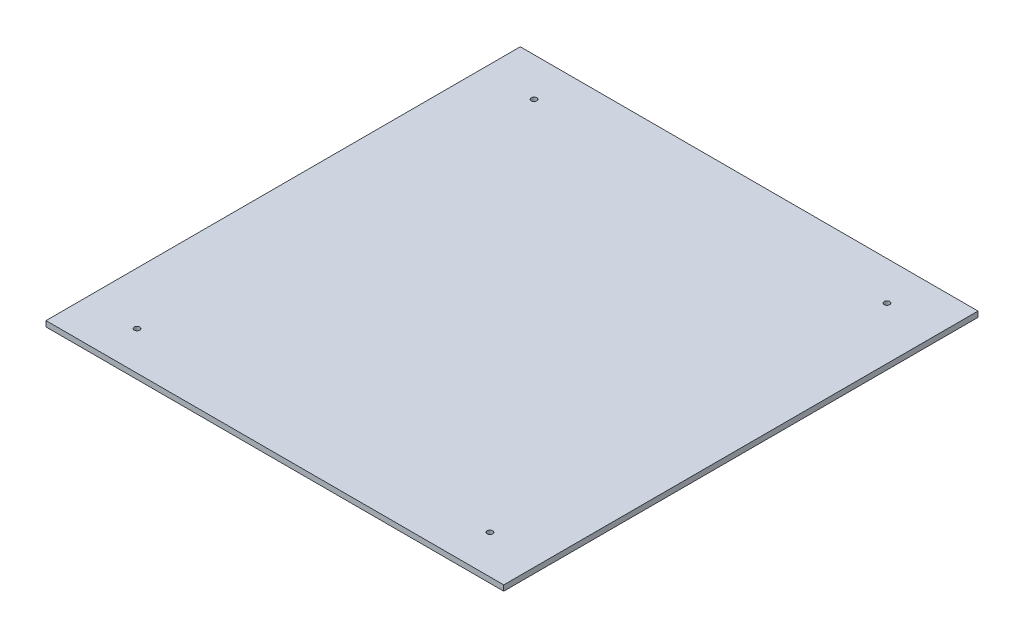
ISO-10303-21;
HEADER;
FILE_DESCRIPTION(('STEP AP214'),'2;1');
FILE_NAME('part.step','',(''),(''),'','','');
FILE_SCHEMA(('AUTOMOTIVE_DESIGN { 1 0 10303 214 1 1 1 1 }'));
ENDSEC;
DATA;
#1=APPLICATION_CONTEXT('core data for automotive mechanical design processes');
#2=APPLICATION_PROTOCOL_DEFINITION('international standard','automotive_design',2000,#1);
#3=PRODUCT_CONTEXT('',#1,'mechanical');
#4=PRODUCT('Part','Part','',(#3));
#5=PRODUCT_RELATED_PRODUCT_CATEGORY('part','',(#4));
#6=PRODUCT_DEFINITION_FORMATION('','',#4);
#7=PRODUCT_DEFINITION_CONTEXT('part definition',#1,'design');
#8=PRODUCT_DEFINITION('design','',#6,#7);
#9=PRODUCT_DEFINITION_SHAPE('','',#8);
#10=(LENGTH_UNIT() NAMED_UNIT(*) SI_UNIT(.MILLI.,.METRE.));
#11=(NAMED_UNIT(*) PLANE_ANGLE_UNIT() SI_UNIT($,.RADIAN.));
#12=(NAMED_UNIT(*) SI_UNIT($,.STERADIAN.) SOLID_ANGLE_UNIT());
#13=UNCERTAINTY_MEASURE_WITH_UNIT(LENGTH_MEASURE(1.E-05),#10,'distance_accuracy_value','');
#14=(GEOMETRIC_REPRESENTATION_CONTEXT(3) GLOBAL_UNCERTAINTY_ASSIGNED_CONTEXT((#13)) GLOBAL_UNIT_ASSIGNED_CONTEXT((#10,
#11,#12)) REPRESENTATION_CONTEXT('',''));
#15=CARTESIAN_POINT('',(0.,0.,0.));
#16=DIRECTION('',(0.,0.,1.));
#17=DIRECTION('',(1.,0.,0.));
#18=AXIS2_PLACEMENT_3D('',#15,#16,#17);
#19=CARTESIAN_POINT('',(-207.5,5.,215.));
#20=DIRECTION('',(1.,0.,0.));
#21=DIRECTION('',(0.,0.,-1.));
#22=AXIS2_PLACEMENT_3D('',#19,#20,#21);
#23=PLANE('',#22);
#24=DIRECTION('',(0.,0.,1.));
#25=VECTOR('',#24,1.);
#26=CARTESIAN_POINT('',(-207.5,0.,215.));
#27=LINE('',#26,#25);
#28=CARTESIAN_POINT('',(-207.5,0.,-215.));
#29=VERTEX_POINT('',#28);
#30=CARTESIAN_POINT('',(-207.5,0.,215.));
#31=VERTEX_POINT('',#30);
#32=EDGE_CURVE('E106',#29,#31,#27,.T.);
#33=ORIENTED_EDGE('',*,*,#32,.T.);
#34=DIRECTION('',(0.,-1.,0.));
#35=VECTOR('',#34,1.);
#36=CARTESIAN_POINT('',(-207.5,5.,215.));
#37=LINE('',#36,#35);
#38=CARTESIAN_POINT('',(-207.5,5.,215.));
#39=VERTEX_POINT('',#38);
#40=EDGE_CURVE('E11',#39,#31,#37,.T.);
#41=ORIENTED_EDGE('',*,*,#40,.F.);
#42=DIRECTION('',(0.,0.,1.));
#43=VECTOR('',#42,1.);
#44=CARTESIAN_POINT('',(-207.5,5.,215.));
#45=LINE('',#44,#43);
#46=CARTESIAN_POINT('',(-207.5,5.,-215.));
#47=VERTEX_POINT('',#46);
#48=EDGE_CURVE('E90',#47,#39,#45,.T.);
#49=ORIENTED_EDGE('',*,*,#48,.F.);
#50=DIRECTION('',(0.,-1.,0.));
#51=VECTOR('',#50,1.);
#52=CARTESIAN_POINT('',(-207.5,5.,-215.));
#53=LINE('',#52,#51);
#54=EDGE_CURVE('E102',#47,#29,#53,.T.);
#55=ORIENTED_EDGE('',*,*,#54,.T.);
#56=EDGE_LOOP('',(#33,#41,#49,#55));
#57=FACE_BOUND('',#56,.T.);
#58=ADVANCED_FACE('F38',(#57),#23,.F.);
#59=CARTESIAN_POINT('',(207.5,5.,215.));
#60=DIRECTION('',(0.,0.,-1.));
#61=DIRECTION('',(-1.,0.,0.));
#62=AXIS2_PLACEMENT_3D('',#59,#60,#61);
#63=PLANE('',#62);
#64=DIRECTION('',(1.,0.,0.));
#65=VECTOR('',#64,1.);
#66=CARTESIAN_POINT('',(207.5,0.,215.));
#67=LINE('',#66,#65);
#68=CARTESIAN_POINT('',(207.5,0.,215.));
#69=VERTEX_POINT('',#68);
#70=EDGE_CURVE('E95',#31,#69,#67,.T.);
#71=ORIENTED_EDGE('',*,*,#70,.T.);
#72=DIRECTION('',(0.,-1.,0.));
#73=VECTOR('',#72,1.);
#74=CARTESIAN_POINT('',(207.5,5.,215.));
#75=LINE('',#74,#73);
#76=CARTESIAN_POINT('',(207.5,5.,215.));
#77=VERTEX_POINT('',#76);
#78=EDGE_CURVE('E47',#77,#69,#75,.T.);
#79=ORIENTED_EDGE('',*,*,#78,.F.);
#80=DIRECTION('',(1.,0.,0.));
#81=VECTOR('',#80,1.);
#82=CARTESIAN_POINT('',(207.5,5.,215.));
#83=LINE('',#82,#81);
#84=EDGE_CURVE('E85',#39,#77,#83,.T.);
#85=ORIENTED_EDGE('',*,*,#84,.F.);
#86=ORIENTED_EDGE('',*,*,#40,.T.);
#87=EDGE_LOOP('',(#71,#79,#85,#86));
#88=FACE_BOUND('',#87,.T.);
#89=ADVANCED_FACE('F94',(#88),#63,.F.);
#90=CARTESIAN_POINT('',(207.5,5.,215.));
#91=DIRECTION('',(-1.,0.,0.));
#92=DIRECTION('',(0.,0.,1.));
#93=AXIS2_PLACEMENT_3D('',#90,#91,#92);
#94=PLANE('',#93);
#95=DIRECTION('',(0.,0.,-1.));
#96=VECTOR('',#95,1.);
#97=CARTESIAN_POINT('',(207.5,0.,215.));
#98=LINE('',#97,#96);
#99=CARTESIAN_POINT('',(207.5,0.,-215.));
#100=VERTEX_POINT('',#99);
#101=EDGE_CURVE('E72',#69,#100,#98,.T.);
#102=ORIENTED_EDGE('',*,*,#101,.T.);
#103=DIRECTION('',(0.,-1.,0.));
#104=VECTOR('',#103,1.);
#105=CARTESIAN_POINT('',(207.5,5.,-215.));
#106=LINE('',#105,#104);
#107=CARTESIAN_POINT('',(207.5,5.,-215.));
#108=VERTEX_POINT('',#107);
#109=EDGE_CURVE('E97',#108,#100,#106,.T.);
#110=ORIENTED_EDGE('',*,*,#109,.F.);
#111=DIRECTION('',(0.,0.,-1.));
#112=VECTOR('',#111,1.);
#113=CARTESIAN_POINT('',(207.5,5.,215.));
#114=LINE('',#113,#112);
#115=EDGE_CURVE('E88',#77,#108,#114,.T.);
#116=ORIENTED_EDGE('',*,*,#115,.F.);
#117=ORIENTED_EDGE('',*,*,#78,.T.);
#118=EDGE_LOOP('',(#102,#110,#116,#117));
#119=FACE_BOUND('',#118,.T.);
#120=ADVANCED_FACE('F98',(#119),#94,.F.);
#121=CARTESIAN_POINT('',(207.5,5.,-215.));
#122=DIRECTION('',(0.,0.,1.));
#123=DIRECTION('',(1.,0.,0.));
#124=AXIS2_PLACEMENT_3D('',#121,#122,#123);
#125=PLANE('',#124);
#126=DIRECTION('',(-1.,0.,0.));
#127=VECTOR('',#126,1.);
#128=CARTESIAN_POINT('',(207.5,0.,-215.));
#129=LINE('',#128,#127);
#130=EDGE_CURVE('E78',#100,#29,#129,.T.);
#131=ORIENTED_EDGE('',*,*,#130,.T.);
#132=ORIENTED_EDGE('',*,*,#54,.F.);
#133=DIRECTION('',(-1.,0.,0.));
#134=VECTOR('',#133,1.);
#135=CARTESIAN_POINT('',(207.5,5.,-215.));
#136=LINE('',#135,#134);
#137=EDGE_CURVE('E55',#108,#47,#136,.T.);
#138=ORIENTED_EDGE('',*,*,#137,.F.);
#139=ORIENTED_EDGE('',*,*,#109,.T.);
#140=EDGE_LOOP('',(#131,#132,#138,#139));
#141=FACE_BOUND('',#140,.T.);
#142=ADVANCED_FACE('F120',(#141),#125,.F.);
#143=CARTESIAN_POINT('',(0.,5.,0.));
#144=DIRECTION('',(0.,1.,0.));
#145=DIRECTION('',(0.,0.,1.));
#146=AXIS2_PLACEMENT_3D('',#143,#144,#145);
#147=PLANE('',#146);
#148=CARTESIAN_POINT('',(-160.,5.,180.));
#149=DIRECTION('',(0.,1.,0.));
#150=DIRECTION('',(0.,0.,-1.));
#151=AXIS2_PLACEMENT_3D('',#148,#149,#150);
#152=CIRCLE('',#151,2.5);
#153=CARTESIAN_POINT('',(-160.,5.,177.5));
#154=VERTEX_POINT('',#153);
#155=EDGE_CURVE('E135',#154,#154,#152,.T.);
#156=ORIENTED_EDGE('',*,*,#155,.F.);
#157=EDGE_LOOP('',(#156));
#158=FACE_BOUND('',#157,.T.);
#159=CARTESIAN_POINT('',(160.,5.,180.));
#160=DIRECTION('',(0.,1.,0.));
#161=DIRECTION('',(0.,0.,1.));
#162=AXIS2_PLACEMENT_3D('',#159,#160,#161);
#163=CIRCLE('',#162,2.5);
#164=CARTESIAN_POINT('',(160.,5.,182.5));
#165=VERTEX_POINT('',#164);
#166=EDGE_CURVE('E143',#165,#165,#163,.T.);
#167=ORIENTED_EDGE('',*,*,#166,.F.);
#168=EDGE_LOOP('',(#167));
#169=FACE_BOUND('',#168,.T.);
#170=CARTESIAN_POINT('',(160.,5.,-180.));
#171=DIRECTION('',(0.,1.,0.));
#172=DIRECTION('',(0.,0.,-1.));
#173=AXIS2_PLACEMENT_3D('',#170,#171,#172);
#174=CIRCLE('',#173,2.5);
#175=CARTESIAN_POINT('',(160.,5.,-182.5));
#176=VERTEX_POINT('',#175);
#177=EDGE_CURVE('E151',#176,#176,#174,.T.);
#178=ORIENTED_EDGE('',*,*,#177,.F.);
#179=EDGE_LOOP('',(#178));
#180=FACE_BOUND('',#179,.T.);
#181=CARTESIAN_POINT('',(-160.,5.,-180.));
#182=DIRECTION('',(0.,1.,0.));
#183=DIRECTION('',(0.,0.,1.));
#184=AXIS2_PLACEMENT_3D('',#181,#182,#183);
#185=CIRCLE('',#184,2.5);
#186=CARTESIAN_POINT('',(-160.,5.,-177.5));
#187=VERTEX_POINT('',#186);
#188=EDGE_CURVE('E127',#187,#187,#185,.T.);
#189=ORIENTED_EDGE('',*,*,#188,.F.);
#190=EDGE_LOOP('',(#189));
#191=FACE_BOUND('',#190,.T.);
#192=ORIENTED_EDGE('',*,*,#48,.T.);
#193=ORIENTED_EDGE('',*,*,#84,.T.);
#194=ORIENTED_EDGE('',*,*,#115,.T.);
#195=ORIENTED_EDGE('',*,*,#137,.T.);
#196=EDGE_LOOP('',(#192,#193,#194,#195));
#197=FACE_BOUND('',#196,.T.);
#198=ADVANCED_FACE('F86',(#158,#169,#180,#191,#197),#147,.T.);
#199=CARTESIAN_POINT('',(0.,0.,0.));
#200=DIRECTION('',(0.,1.,0.));
#201=DIRECTION('',(0.,0.,1.));
#202=AXIS2_PLACEMENT_3D('',#199,#200,#201);
#203=PLANE('',#202);
#204=CARTESIAN_POINT('',(-160.,0.,180.));
#205=DIRECTION('',(0.,1.,0.));
#206=DIRECTION('',(0.,0.,-1.));
#207=AXIS2_PLACEMENT_3D('',#204,#205,#206);
#208=CIRCLE('',#207,2.5);
#209=CARTESIAN_POINT('',(-160.,0.,177.5));
#210=VERTEX_POINT('',#209);
#211=EDGE_CURVE('E139',#210,#210,#208,.T.);
#212=ORIENTED_EDGE('',*,*,#211,.T.);
#213=EDGE_LOOP('',(#212));
#214=FACE_BOUND('',#213,.T.);
#215=CARTESIAN_POINT('',(160.,0.,180.));
#216=DIRECTION('',(0.,1.,0.));
#217=DIRECTION('',(0.,0.,1.));
#218=AXIS2_PLACEMENT_3D('',#215,#216,#217);
#219=CIRCLE('',#218,2.5);
#220=CARTESIAN_POINT('',(160.,0.,182.5));
#221=VERTEX_POINT('',#220);
#222=EDGE_CURVE('E147',#221,#221,#219,.T.);
#223=ORIENTED_EDGE('',*,*,#222,.T.);
#224=EDGE_LOOP('',(#223));
#225=FACE_BOUND('',#224,.T.);
#226=CARTESIAN_POINT('',(160.,0.,-180.));
#227=DIRECTION('',(0.,1.,0.));
#228=DIRECTION('',(0.,0.,-1.));
#229=AXIS2_PLACEMENT_3D('',#226,#227,#228);
#230=CIRCLE('',#229,2.5);
#231=CARTESIAN_POINT('',(160.,0.,-182.5));
#232=VERTEX_POINT('',#231);
#233=EDGE_CURVE('E131',#232,#232,#230,.T.);
#234=ORIENTED_EDGE('',*,*,#233,.T.);
#235=EDGE_LOOP('',(#234));
#236=FACE_BOUND('',#235,.T.);
#237=CARTESIAN_POINT('',(-160.,0.,-180.));
#238=DIRECTION('',(0.,1.,0.));
#239=DIRECTION('',(0.,0.,1.));
#240=AXIS2_PLACEMENT_3D('',#237,#238,#239);
#241=CIRCLE('',#240,2.5);
#242=CARTESIAN_POINT('',(-160.,0.,-177.5));
#243=VERTEX_POINT('',#242);
#244=EDGE_CURVE('E110',#243,#243,#241,.T.);
#245=ORIENTED_EDGE('',*,*,#244,.T.);
#246=EDGE_LOOP('',(#245));
#247=FACE_BOUND('',#246,.T.);
#248=ORIENTED_EDGE('',*,*,#32,.F.);
#249=ORIENTED_EDGE('',*,*,#130,.F.);
#250=ORIENTED_EDGE('',*,*,#101,.F.);
#251=ORIENTED_EDGE('',*,*,#70,.F.);
#252=EDGE_LOOP('',(#248,#249,#250,#251));
#253=FACE_BOUND('',#252,.T.);
#254=ADVANCED_FACE('F123',(#214,#225,#236,#247,#253),#203,.F.);
#255=CARTESIAN_POINT('',(-160.,0.,-180.));
#256=DIRECTION('',(0.,1.,0.));
#257=DIRECTION('',(0.,0.,1.));
#258=AXIS2_PLACEMENT_3D('',#255,#256,#257);
#259=CYLINDRICAL_SURFACE('',#258,2.5);
#260=ORIENTED_EDGE('',*,*,#244,.F.);
#261=EDGE_LOOP('',(#260));
#262=FACE_BOUND('',#261,.T.);
#263=ORIENTED_EDGE('',*,*,#188,.T.);
#264=EDGE_LOOP('',(#263));
#265=FACE_BOUND('',#264,.T.);
#266=ADVANCED_FACE('F165',(#262,#265),#259,.F.);
#267=CARTESIAN_POINT('',(160.,0.,-180.));
#268=DIRECTION('',(0.,1.,0.));
#269=DIRECTION('',(0.,0.,1.));
#270=AXIS2_PLACEMENT_3D('',#267,#268,#269);
#271=CYLINDRICAL_SURFACE('',#270,2.5);
#272=ORIENTED_EDGE('',*,*,#233,.F.);
#273=EDGE_LOOP('',(#272));
#274=FACE_BOUND('',#273,.T.);
#275=ORIENTED_EDGE('',*,*,#177,.T.);
#276=EDGE_LOOP('',(#275));
#277=FACE_BOUND('',#276,.T.);
#278=ADVANCED_FACE('F161',(#274,#277),#271,.F.);
#279=CARTESIAN_POINT('',(160.,0.,180.));
#280=DIRECTION('',(0.,1.,0.));
#281=DIRECTION('',(0.,0.,1.));
#282=AXIS2_PLACEMENT_3D('',#279,#280,#281);
#283=CYLINDRICAL_SURFACE('',#282,2.5);
#284=ORIENTED_EDGE('',*,*,#222,.F.);
#285=EDGE_LOOP('',(#284));
#286=FACE_BOUND('',#285,.T.);
#287=ORIENTED_EDGE('',*,*,#166,.T.);
#288=EDGE_LOOP('',(#287));
#289=FACE_BOUND('',#288,.T.);
#290=ADVANCED_FACE('F164',(#286,#289),#283,.F.);
#291=CARTESIAN_POINT('',(-160.,0.,180.));
#292=DIRECTION('',(0.,1.,0.));
#293=DIRECTION('',(0.,0.,1.));
#294=AXIS2_PLACEMENT_3D('',#291,#292,#293);
#295=CYLINDRICAL_SURFACE('',#294,2.5);
#296=ORIENTED_EDGE('',*,*,#211,.F.);
#297=EDGE_LOOP('',(#296));
#298=FACE_BOUND('',#297,.T.);
#299=ORIENTED_EDGE('',*,*,#155,.T.);
#300=EDGE_LOOP('',(#299));
#301=FACE_BOUND('',#300,.T.);
#302=ADVANCED_FACE('F228',(#298,#301),#295,.F.);
#303=CLOSED_SHELL('',(#58,#89,#120,#142,#198,#254,#266,#278,#290,#302));
#304=MANIFOLD_SOLID_BREP('B2',#303);
#305=ADVANCED_BREP_SHAPE_REPRESENTATION('',(#18,#304),#14);
#306=SHAPE_DEFINITION_REPRESENTATION(#9,#305);
ENDSEC;
END-ISO-10303-21;
